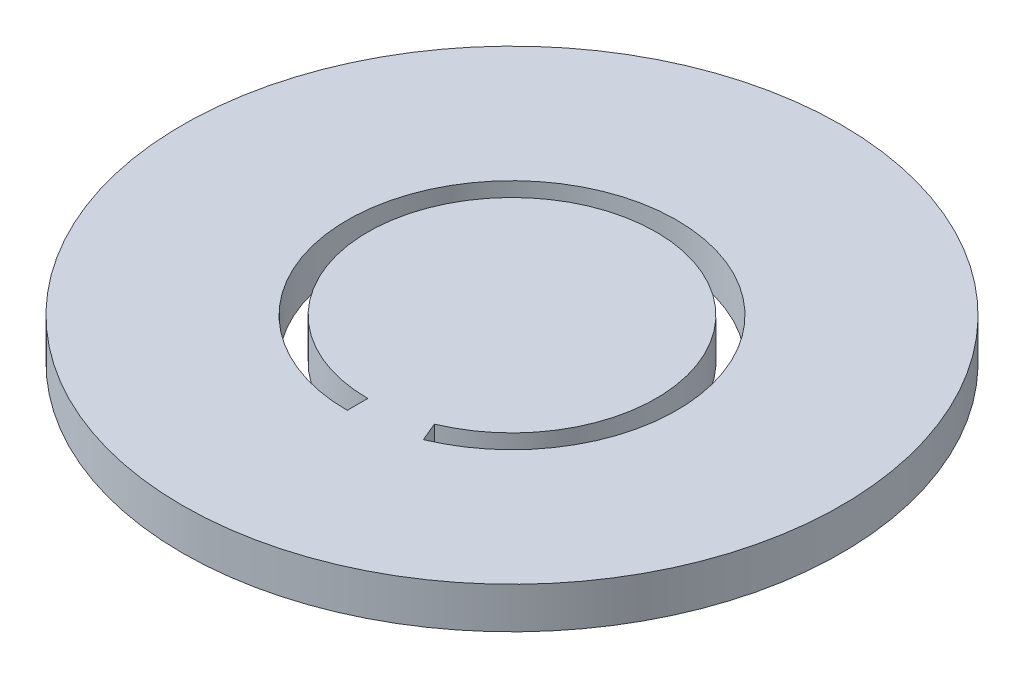
ISO-10303-21;
HEADER;
FILE_DESCRIPTION(('STEP AP214'),'2;1');
FILE_NAME('part.step','',(''),(''),'','','');
FILE_SCHEMA(('AUTOMOTIVE_DESIGN { 1 0 10303 214 1 1 1 1 }'));
ENDSEC;
DATA;
#1=APPLICATION_CONTEXT('core data for automotive mechanical design processes');
#2=APPLICATION_PROTOCOL_DEFINITION('international standard','automotive_design',2000,#1);
#3=PRODUCT_CONTEXT('',#1,'mechanical');
#4=PRODUCT('Part','Part','',(#3));
#5=PRODUCT_RELATED_PRODUCT_CATEGORY('part','',(#4));
#6=PRODUCT_DEFINITION_FORMATION('','',#4);
#7=PRODUCT_DEFINITION_CONTEXT('part definition',#1,'design');
#8=PRODUCT_DEFINITION('design','',#6,#7);
#9=PRODUCT_DEFINITION_SHAPE('','',#8);
#10=(LENGTH_UNIT() NAMED_UNIT(*) SI_UNIT(.MILLI.,.METRE.));
#11=(NAMED_UNIT(*) PLANE_ANGLE_UNIT() SI_UNIT($,.RADIAN.));
#12=(NAMED_UNIT(*) SI_UNIT($,.STERADIAN.) SOLID_ANGLE_UNIT());
#13=UNCERTAINTY_MEASURE_WITH_UNIT(LENGTH_MEASURE(1.E-05),#10,'distance_accuracy_value','');
#14=(GEOMETRIC_REPRESENTATION_CONTEXT(3) GLOBAL_UNCERTAINTY_ASSIGNED_CONTEXT((#13)) GLOBAL_UNIT_ASSIGNED_CONTEXT((#10,
#11,#12)) REPRESENTATION_CONTEXT('',''));
#15=CARTESIAN_POINT('',(0.,0.,0.));
#16=DIRECTION('',(0.,0.,1.));
#17=DIRECTION('',(1.,0.,0.));
#18=AXIS2_PLACEMENT_3D('',#15,#16,#17);
#19=CARTESIAN_POINT('',(0.,0.5,0.));
#20=DIRECTION('',(0.,1.,0.));
#21=DIRECTION('',(0.,0.,1.));
#22=AXIS2_PLACEMENT_3D('',#19,#20,#21);
#23=PLANE('',#22);
#24=CARTESIAN_POINT('',(0.,0.5,0.));
#25=DIRECTION('',(0.,1.,0.));
#26=DIRECTION('',(0.,0.,1.));
#27=AXIS2_PLACEMENT_3D('',#24,#25,#26);
#28=CIRCLE('',#27,4.);
#29=CARTESIAN_POINT('',(0.,0.5,4.));
#30=VERTEX_POINT('',#29);
#31=EDGE_CURVE('E11',#30,#30,#28,.T.);
#32=ORIENTED_EDGE('',*,*,#31,.T.);
#33=EDGE_LOOP('',(#32));
#34=FACE_BOUND('',#33,.T.);
#35=DIRECTION('',(0.,0.,-1.));
#36=VECTOR('',#35,1.);
#37=CARTESIAN_POINT('',(0.,0.5,1.75));
#38=LINE('',#37,#36);
#39=CARTESIAN_POINT('',(0.,0.5,2.));
#40=VERTEX_POINT('',#39);
#41=CARTESIAN_POINT('',(0.,0.5,1.75));
#42=VERTEX_POINT('',#41);
#43=EDGE_CURVE('E82',#40,#42,#38,.T.);
#44=ORIENTED_EDGE('',*,*,#43,.F.);
#45=CARTESIAN_POINT('',(0.,0.5,0.));
#46=DIRECTION('',(0.,1.,0.));
#47=DIRECTION('',(0.,0.,1.));
#48=AXIS2_PLACEMENT_3D('',#45,#46,#47);
#49=CIRCLE('',#48,2.);
#50=CARTESIAN_POINT('',(0.76955317705089,0.5,1.84601947651992));
#51=VERTEX_POINT('',#50);
#52=EDGE_CURVE('E74',#51,#40,#49,.T.);
#53=ORIENTED_EDGE('',*,*,#52,.F.);
#54=DIRECTION('',(0.384776588525445,0.,0.92300973825996));
#55=VECTOR('',#54,1.);
#56=CARTESIAN_POINT('',(0.673359029919529,0.5,1.61526704195493));
#57=LINE('',#56,#55);
#58=CARTESIAN_POINT('',(0.673359029919529,0.5,1.61526704195493));
#59=VERTEX_POINT('',#58);
#60=EDGE_CURVE('E95',#59,#51,#57,.T.);
#61=ORIENTED_EDGE('',*,*,#60,.F.);
#62=CARTESIAN_POINT('',(0.,0.5,0.));
#63=DIRECTION('',(0.,-1.,0.));
#64=DIRECTION('',(0.,0.,1.));
#65=AXIS2_PLACEMENT_3D('',#62,#63,#64);
#66=CIRCLE('',#65,1.75);
#67=EDGE_CURVE('E93',#42,#59,#66,.T.);
#68=ORIENTED_EDGE('',*,*,#67,.F.);
#69=EDGE_LOOP('',(#44,#53,#61,#68));
#70=FACE_BOUND('',#69,.T.);
#71=ADVANCED_FACE('F33',(#34,#70),#23,.T.);
#72=CARTESIAN_POINT('',(0.,0.,0.));
#73=DIRECTION('',(0.,1.,0.));
#74=DIRECTION('',(0.,0.,1.));
#75=AXIS2_PLACEMENT_3D('',#72,#73,#74);
#76=PLANE('',#75);
#77=CARTESIAN_POINT('',(0.,0.,0.));
#78=DIRECTION('',(0.,1.,0.));
#79=DIRECTION('',(0.,0.,1.));
#80=AXIS2_PLACEMENT_3D('',#77,#78,#79);
#81=CIRCLE('',#80,4.);
#82=CARTESIAN_POINT('',(0.,0.,4.));
#83=VERTEX_POINT('',#82);
#84=EDGE_CURVE('E37',#83,#83,#81,.T.);
#85=ORIENTED_EDGE('',*,*,#84,.F.);
#86=EDGE_LOOP('',(#85));
#87=FACE_BOUND('',#86,.T.);
#88=CARTESIAN_POINT('',(0.,0.,0.));
#89=DIRECTION('',(0.,1.,0.));
#90=DIRECTION('',(0.,0.,1.));
#91=AXIS2_PLACEMENT_3D('',#88,#89,#90);
#92=CIRCLE('',#91,2.);
#93=CARTESIAN_POINT('',(0.76955317705089,0.,1.84601947651992));
#94=VERTEX_POINT('',#93);
#95=CARTESIAN_POINT('',(0.,0.,2.));
#96=VERTEX_POINT('',#95);
#97=EDGE_CURVE('E56',#94,#96,#92,.T.);
#98=ORIENTED_EDGE('',*,*,#97,.T.);
#99=DIRECTION('',(0.,0.,-1.));
#100=VECTOR('',#99,1.);
#101=CARTESIAN_POINT('',(0.,0.,1.75));
#102=LINE('',#101,#100);
#103=CARTESIAN_POINT('',(0.,0.,1.75));
#104=VERTEX_POINT('',#103);
#105=EDGE_CURVE('E89',#96,#104,#102,.T.);
#106=ORIENTED_EDGE('',*,*,#105,.T.);
#107=CARTESIAN_POINT('',(0.,0.,0.));
#108=DIRECTION('',(0.,-1.,0.));
#109=DIRECTION('',(0.,0.,1.));
#110=AXIS2_PLACEMENT_3D('',#107,#108,#109);
#111=CIRCLE('',#110,1.75);
#112=CARTESIAN_POINT('',(0.673359029919529,0.,1.61526704195493));
#113=VERTEX_POINT('',#112);
#114=EDGE_CURVE('E101',#104,#113,#111,.T.);
#115=ORIENTED_EDGE('',*,*,#114,.T.);
#116=DIRECTION('',(0.384776588525445,0.,0.92300973825996));
#117=VECTOR('',#116,1.);
#118=CARTESIAN_POINT('',(0.673359029919529,0.,1.61526704195493));
#119=LINE('',#118,#117);
#120=EDGE_CURVE('E83',#113,#94,#119,.T.);
#121=ORIENTED_EDGE('',*,*,#120,.T.);
#122=EDGE_LOOP('',(#98,#106,#115,#121));
#123=FACE_BOUND('',#122,.T.);
#124=ADVANCED_FACE('F112',(#87,#123),#76,.F.);
#125=CARTESIAN_POINT('',(0.,0.5,0.));
#126=DIRECTION('',(0.,-1.,0.));
#127=DIRECTION('',(0.,0.,-1.));
#128=AXIS2_PLACEMENT_3D('',#125,#126,#127);
#129=CYLINDRICAL_SURFACE('',#128,4.);
#130=ORIENTED_EDGE('',*,*,#31,.F.);
#131=EDGE_LOOP('',(#130));
#132=FACE_BOUND('',#131,.T.);
#133=ORIENTED_EDGE('',*,*,#84,.T.);
#134=EDGE_LOOP('',(#133));
#135=FACE_BOUND('',#134,.T.);
#136=ADVANCED_FACE('F35',(#132,#135),#129,.T.);
#137=CARTESIAN_POINT('',(0.,0.5,0.));
#138=DIRECTION('',(0.,-1.,0.));
#139=DIRECTION('',(0.,0.,-1.));
#140=AXIS2_PLACEMENT_3D('',#137,#138,#139);
#141=CYLINDRICAL_SURFACE('',#140,2.);
#142=ORIENTED_EDGE('',*,*,#97,.F.);
#143=DIRECTION('',(0.,-1.,0.));
#144=VECTOR('',#143,1.);
#145=CARTESIAN_POINT('',(0.76955317705089,0.5,1.84601947651992));
#146=LINE('',#145,#144);
#147=EDGE_CURVE('E78',#51,#94,#146,.T.);
#148=ORIENTED_EDGE('',*,*,#147,.F.);
#149=ORIENTED_EDGE('',*,*,#52,.T.);
#150=DIRECTION('',(0.,-1.,0.));
#151=VECTOR('',#150,1.);
#152=CARTESIAN_POINT('',(0.,0.5,2.));
#153=LINE('',#152,#151);
#154=EDGE_CURVE('E77',#40,#96,#153,.T.);
#155=ORIENTED_EDGE('',*,*,#154,.T.);
#156=EDGE_LOOP('',(#142,#148,#149,#155));
#157=FACE_BOUND('',#156,.T.);
#158=ADVANCED_FACE('F76',(#157),#141,.F.);
#159=CARTESIAN_POINT('',(0.,0.5,1.75));
#160=DIRECTION('',(-1.,0.,0.));
#161=DIRECTION('',(0.,0.,1.));
#162=AXIS2_PLACEMENT_3D('',#159,#160,#161);
#163=PLANE('',#162);
#164=ORIENTED_EDGE('',*,*,#105,.F.);
#165=ORIENTED_EDGE('',*,*,#154,.F.);
#166=ORIENTED_EDGE('',*,*,#43,.T.);
#167=DIRECTION('',(0.,-1.,0.));
#168=VECTOR('',#167,1.);
#169=CARTESIAN_POINT('',(0.,0.5,1.75));
#170=LINE('',#169,#168);
#171=EDGE_CURVE('E90',#42,#104,#170,.T.);
#172=ORIENTED_EDGE('',*,*,#171,.T.);
#173=EDGE_LOOP('',(#164,#165,#166,#172));
#174=FACE_BOUND('',#173,.T.);
#175=ADVANCED_FACE('F86',(#174),#163,.T.);
#176=CARTESIAN_POINT('',(0.,0.5,0.));
#177=DIRECTION('',(0.,-1.,0.));
#178=DIRECTION('',(0.,0.,-1.));
#179=AXIS2_PLACEMENT_3D('',#176,#177,#178);
#180=CYLINDRICAL_SURFACE('',#179,1.75);
#181=ORIENTED_EDGE('',*,*,#114,.F.);
#182=ORIENTED_EDGE('',*,*,#171,.F.);
#183=ORIENTED_EDGE('',*,*,#67,.T.);
#184=DIRECTION('',(0.,-1.,0.));
#185=VECTOR('',#184,1.);
#186=CARTESIAN_POINT('',(0.673359029919529,0.5,1.61526704195493));
#187=LINE('',#186,#185);
#188=EDGE_CURVE('E48',#59,#113,#187,.T.);
#189=ORIENTED_EDGE('',*,*,#188,.T.);
#190=EDGE_LOOP('',(#181,#182,#183,#189));
#191=FACE_BOUND('',#190,.T.);
#192=ADVANCED_FACE('F110',(#191),#180,.T.);
#193=CARTESIAN_POINT('',(0.673359029919529,0.5,1.61526704195493));
#194=DIRECTION('',(0.92300973825996,0.,-0.384776588525445));
#195=DIRECTION('',(-0.384776588525445,0.,-0.92300973825996));
#196=AXIS2_PLACEMENT_3D('',#193,#194,#195);
#197=PLANE('',#196);
#198=ORIENTED_EDGE('',*,*,#120,.F.);
#199=ORIENTED_EDGE('',*,*,#188,.F.);
#200=ORIENTED_EDGE('',*,*,#60,.T.);
#201=ORIENTED_EDGE('',*,*,#147,.T.);
#202=EDGE_LOOP('',(#198,#199,#200,#201));
#203=FACE_BOUND('',#202,.T.);
#204=ADVANCED_FACE('F113',(#203),#197,.T.);
#205=CLOSED_SHELL('',(#71,#124,#136,#158,#175,#192,#204));
#206=MANIFOLD_SOLID_BREP('B2',#205);
#207=ADVANCED_BREP_SHAPE_REPRESENTATION('',(#18,#206),#14);
#208=SHAPE_DEFINITION_REPRESENTATION(#9,#207);
ENDSEC;
END-ISO-10303-21;
